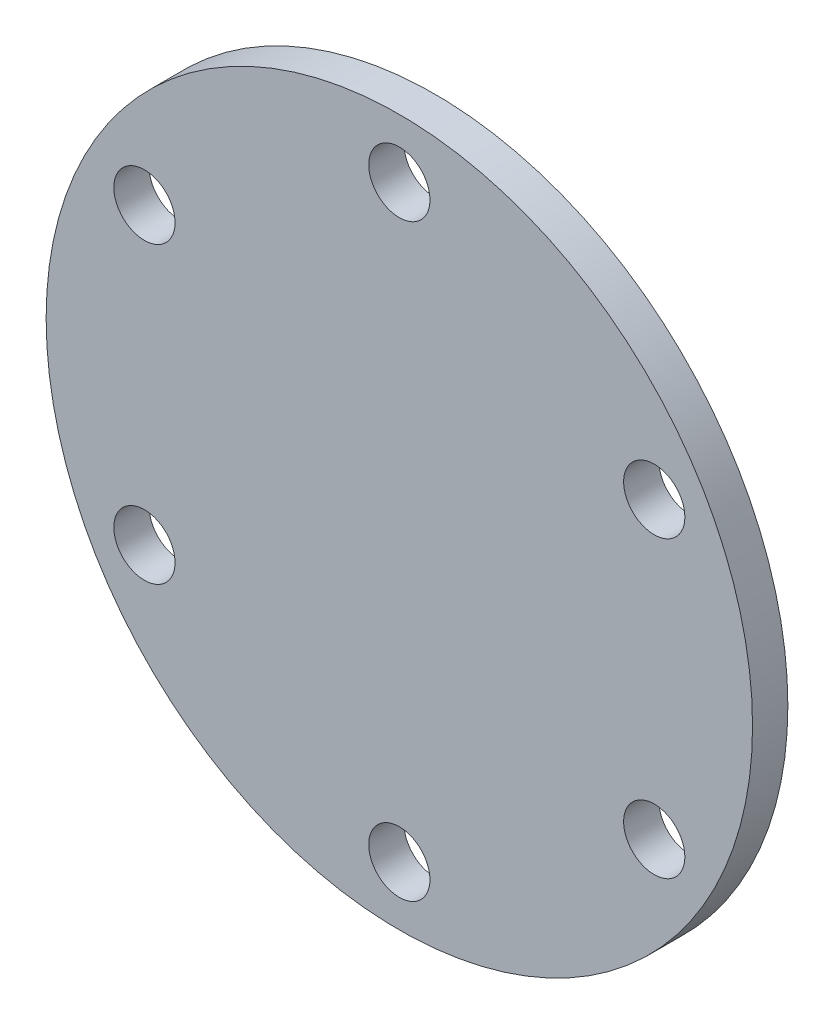
ISO-10303-21;
HEADER;
FILE_DESCRIPTION(('STEP AP214'),'2;1');
FILE_NAME('part.step','',(''),(''),'','','');
FILE_SCHEMA(('AUTOMOTIVE_DESIGN { 1 0 10303 214 1 1 1 1 }'));
ENDSEC;
DATA;
#1=APPLICATION_CONTEXT('core data for automotive mechanical design processes');
#2=APPLICATION_PROTOCOL_DEFINITION('international standard','automotive_design',2000,#1);
#3=PRODUCT_CONTEXT('',#1,'mechanical');
#4=PRODUCT('Part','Part','',(#3));
#5=PRODUCT_RELATED_PRODUCT_CATEGORY('part','',(#4));
#6=PRODUCT_DEFINITION_FORMATION('','',#4);
#7=PRODUCT_DEFINITION_CONTEXT('part definition',#1,'design');
#8=PRODUCT_DEFINITION('design','',#6,#7);
#9=PRODUCT_DEFINITION_SHAPE('','',#8);
#10=(LENGTH_UNIT() NAMED_UNIT(*) SI_UNIT(.MILLI.,.METRE.));
#11=(NAMED_UNIT(*) PLANE_ANGLE_UNIT() SI_UNIT($,.RADIAN.));
#12=(NAMED_UNIT(*) SI_UNIT($,.STERADIAN.) SOLID_ANGLE_UNIT());
#13=UNCERTAINTY_MEASURE_WITH_UNIT(LENGTH_MEASURE(1.E-05),#10,'distance_accuracy_value','');
#14=(GEOMETRIC_REPRESENTATION_CONTEXT(3) GLOBAL_UNCERTAINTY_ASSIGNED_CONTEXT((#13)) GLOBAL_UNIT_ASSIGNED_CONTEXT((#10,
#11,#12)) REPRESENTATION_CONTEXT('',''));
#15=CARTESIAN_POINT('',(0.,0.,0.));
#16=DIRECTION('',(0.,0.,1.));
#17=DIRECTION('',(1.,0.,0.));
#18=AXIS2_PLACEMENT_3D('',#15,#16,#17);
#19=CARTESIAN_POINT('',(0.,0.,3.));
#20=DIRECTION('',(0.,0.,1.));
#21=DIRECTION('',(1.,0.,0.));
#22=AXIS2_PLACEMENT_3D('',#19,#20,#21);
#23=PLANE('',#22);
#24=CARTESIAN_POINT('',(-21.650635094611,-12.5,3.));
#25=DIRECTION('',(0.,0.,1.));
#26=DIRECTION('',(1.,0.,0.));
#27=AXIS2_PLACEMENT_3D('',#24,#25,#26);
#28=CIRCLE('',#27,2.60000000000024);
#29=CARTESIAN_POINT('',(-19.0506350946107,-12.5,3.));
#30=VERTEX_POINT('',#29);
#31=EDGE_CURVE('E70',#30,#30,#28,.T.);
#32=ORIENTED_EDGE('',*,*,#31,.F.);
#33=EDGE_LOOP('',(#32));
#34=FACE_BOUND('',#33,.T.);
#35=CARTESIAN_POINT('',(21.650635094611,-12.5,3.));
#36=DIRECTION('',(0.,0.,1.));
#37=DIRECTION('',(1.,0.,0.));
#38=AXIS2_PLACEMENT_3D('',#35,#36,#37);
#39=CIRCLE('',#38,2.60000000000012);
#40=CARTESIAN_POINT('',(24.2506350946111,-12.5,3.));
#41=VERTEX_POINT('',#40);
#42=EDGE_CURVE('E58',#41,#41,#39,.T.);
#43=ORIENTED_EDGE('',*,*,#42,.F.);
#44=EDGE_LOOP('',(#43));
#45=FACE_BOUND('',#44,.T.);
#46=CARTESIAN_POINT('',(0.,25.,3.));
#47=DIRECTION('',(0.,0.,1.));
#48=DIRECTION('',(1.,0.,0.));
#49=AXIS2_PLACEMENT_3D('',#46,#47,#48);
#50=CIRCLE('',#49,2.6);
#51=CARTESIAN_POINT('',(2.6,25.,3.));
#52=VERTEX_POINT('',#51);
#53=EDGE_CURVE('E47',#52,#52,#50,.T.);
#54=ORIENTED_EDGE('',*,*,#53,.F.);
#55=EDGE_LOOP('',(#54));
#56=FACE_BOUND('',#55,.T.);
#57=CARTESIAN_POINT('',(0.,0.,3.));
#58=DIRECTION('',(0.,0.,1.));
#59=DIRECTION('',(1.,0.,0.));
#60=AXIS2_PLACEMENT_3D('',#57,#58,#59);
#61=CIRCLE('',#60,30.);
#62=CARTESIAN_POINT('',(30.,0.,3.));
#63=VERTEX_POINT('',#62);
#64=EDGE_CURVE('E10',#63,#63,#61,.T.);
#65=ORIENTED_EDGE('',*,*,#64,.T.);
#66=EDGE_LOOP('',(#65));
#67=FACE_BOUND('',#66,.T.);
#68=CARTESIAN_POINT('',(21.650635094611,12.5,3.));
#69=DIRECTION('',(0.,0.,1.));
#70=DIRECTION('',(1.,0.,0.));
#71=AXIS2_PLACEMENT_3D('',#68,#69,#70);
#72=CIRCLE('',#71,2.60000000000006);
#73=CARTESIAN_POINT('',(24.250635094611,12.5,3.));
#74=VERTEX_POINT('',#73);
#75=EDGE_CURVE('E52',#74,#74,#72,.T.);
#76=ORIENTED_EDGE('',*,*,#75,.F.);
#77=EDGE_LOOP('',(#76));
#78=FACE_BOUND('',#77,.T.);
#79=CARTESIAN_POINT('',(0.,-25.,3.));
#80=DIRECTION('',(0.,0.,1.));
#81=DIRECTION('',(1.,0.,0.));
#82=AXIS2_PLACEMENT_3D('',#79,#80,#81);
#83=CIRCLE('',#82,2.60000000000017);
#84=CARTESIAN_POINT('',(2.60000000000017,-25.,3.));
#85=VERTEX_POINT('',#84);
#86=EDGE_CURVE('E64',#85,#85,#83,.T.);
#87=ORIENTED_EDGE('',*,*,#86,.F.);
#88=EDGE_LOOP('',(#87));
#89=FACE_BOUND('',#88,.T.);
#90=CARTESIAN_POINT('',(-21.650635094611,12.5,3.));
#91=DIRECTION('',(0.,0.,1.));
#92=DIRECTION('',(1.,0.,0.));
#93=AXIS2_PLACEMENT_3D('',#90,#91,#92);
#94=CIRCLE('',#93,2.60000000000029);
#95=CARTESIAN_POINT('',(-19.0506350946107,12.5,3.));
#96=VERTEX_POINT('',#95);
#97=EDGE_CURVE('E76',#96,#96,#94,.T.);
#98=ORIENTED_EDGE('',*,*,#97,.F.);
#99=EDGE_LOOP('',(#98));
#100=FACE_BOUND('',#99,.T.);
#101=ADVANCED_FACE('F36',(#34,#45,#56,#67,#78,#89,#100),#23,.T.);
#102=CARTESIAN_POINT('',(0.,0.,0.));
#103=DIRECTION('',(0.,0.,1.));
#104=DIRECTION('',(1.,0.,0.));
#105=AXIS2_PLACEMENT_3D('',#102,#103,#104);
#106=PLANE('',#105);
#107=CARTESIAN_POINT('',(0.,0.,0.));
#108=DIRECTION('',(0.,0.,1.));
#109=DIRECTION('',(1.,0.,0.));
#110=AXIS2_PLACEMENT_3D('',#107,#108,#109);
#111=CIRCLE('',#110,30.);
#112=CARTESIAN_POINT('',(30.,0.,0.));
#113=VERTEX_POINT('',#112);
#114=EDGE_CURVE('E40',#113,#113,#111,.T.);
#115=ORIENTED_EDGE('',*,*,#114,.F.);
#116=EDGE_LOOP('',(#115));
#117=FACE_BOUND('',#116,.T.);
#118=CARTESIAN_POINT('',(0.,25.,0.));
#119=DIRECTION('',(0.,0.,1.));
#120=DIRECTION('',(1.,0.,0.));
#121=AXIS2_PLACEMENT_3D('',#118,#119,#120);
#122=CIRCLE('',#121,2.6);
#123=CARTESIAN_POINT('',(2.6,25.,0.));
#124=VERTEX_POINT('',#123);
#125=EDGE_CURVE('E49',#124,#124,#122,.T.);
#126=ORIENTED_EDGE('',*,*,#125,.T.);
#127=EDGE_LOOP('',(#126));
#128=FACE_BOUND('',#127,.T.);
#129=CARTESIAN_POINT('',(21.650635094611,12.5,0.));
#130=DIRECTION('',(0.,0.,1.));
#131=DIRECTION('',(1.,0.,0.));
#132=AXIS2_PLACEMENT_3D('',#129,#130,#131);
#133=CIRCLE('',#132,2.60000000000006);
#134=CARTESIAN_POINT('',(24.250635094611,12.5,0.));
#135=VERTEX_POINT('',#134);
#136=EDGE_CURVE('E55',#135,#135,#133,.T.);
#137=ORIENTED_EDGE('',*,*,#136,.T.);
#138=EDGE_LOOP('',(#137));
#139=FACE_BOUND('',#138,.T.);
#140=CARTESIAN_POINT('',(21.650635094611,-12.5,0.));
#141=DIRECTION('',(0.,0.,1.));
#142=DIRECTION('',(1.,0.,0.));
#143=AXIS2_PLACEMENT_3D('',#140,#141,#142);
#144=CIRCLE('',#143,2.60000000000012);
#145=CARTESIAN_POINT('',(24.2506350946111,-12.5,0.));
#146=VERTEX_POINT('',#145);
#147=EDGE_CURVE('E61',#146,#146,#144,.T.);
#148=ORIENTED_EDGE('',*,*,#147,.T.);
#149=EDGE_LOOP('',(#148));
#150=FACE_BOUND('',#149,.T.);
#151=CARTESIAN_POINT('',(0.,-25.,0.));
#152=DIRECTION('',(0.,0.,1.));
#153=DIRECTION('',(1.,0.,0.));
#154=AXIS2_PLACEMENT_3D('',#151,#152,#153);
#155=CIRCLE('',#154,2.60000000000017);
#156=CARTESIAN_POINT('',(2.60000000000017,-25.,0.));
#157=VERTEX_POINT('',#156);
#158=EDGE_CURVE('E67',#157,#157,#155,.T.);
#159=ORIENTED_EDGE('',*,*,#158,.T.);
#160=EDGE_LOOP('',(#159));
#161=FACE_BOUND('',#160,.T.);
#162=CARTESIAN_POINT('',(-21.650635094611,-12.5,0.));
#163=DIRECTION('',(0.,0.,1.));
#164=DIRECTION('',(1.,0.,0.));
#165=AXIS2_PLACEMENT_3D('',#162,#163,#164);
#166=CIRCLE('',#165,2.60000000000024);
#167=CARTESIAN_POINT('',(-19.0506350946107,-12.5,0.));
#168=VERTEX_POINT('',#167);
#169=EDGE_CURVE('E73',#168,#168,#166,.T.);
#170=ORIENTED_EDGE('',*,*,#169,.T.);
#171=EDGE_LOOP('',(#170));
#172=FACE_BOUND('',#171,.T.);
#173=CARTESIAN_POINT('',(-21.650635094611,12.5,0.));
#174=DIRECTION('',(0.,0.,1.));
#175=DIRECTION('',(1.,0.,0.));
#176=AXIS2_PLACEMENT_3D('',#173,#174,#175);
#177=CIRCLE('',#176,2.60000000000029);
#178=CARTESIAN_POINT('',(-19.0506350946107,12.5,0.));
#179=VERTEX_POINT('',#178);
#180=EDGE_CURVE('E79',#179,#179,#177,.T.);
#181=ORIENTED_EDGE('',*,*,#180,.T.);
#182=EDGE_LOOP('',(#181));
#183=FACE_BOUND('',#182,.T.);
#184=ADVANCED_FACE('F89',(#117,#128,#139,#150,#161,#172,#183),#106,.F.);
#185=CARTESIAN_POINT('',(0.,0.,3.));
#186=DIRECTION('',(0.,0.,-1.));
#187=DIRECTION('',(-1.,0.,0.));
#188=AXIS2_PLACEMENT_3D('',#185,#186,#187);
#189=CYLINDRICAL_SURFACE('',#188,30.);
#190=ORIENTED_EDGE('',*,*,#64,.F.);
#191=EDGE_LOOP('',(#190));
#192=FACE_BOUND('',#191,.T.);
#193=ORIENTED_EDGE('',*,*,#114,.T.);
#194=EDGE_LOOP('',(#193));
#195=FACE_BOUND('',#194,.T.);
#196=ADVANCED_FACE('F38',(#192,#195),#189,.T.);
#197=CARTESIAN_POINT('',(0.,25.,3.));
#198=DIRECTION('',(0.,0.,-1.));
#199=DIRECTION('',(-1.,0.,0.));
#200=AXIS2_PLACEMENT_3D('',#197,#198,#199);
#201=CYLINDRICAL_SURFACE('',#200,2.6);
#202=ORIENTED_EDGE('',*,*,#53,.T.);
#203=EDGE_LOOP('',(#202));
#204=FACE_BOUND('',#203,.T.);
#205=ORIENTED_EDGE('',*,*,#125,.F.);
#206=EDGE_LOOP('',(#205));
#207=FACE_BOUND('',#206,.T.);
#208=ADVANCED_FACE('F99',(#204,#207),#201,.F.);
#209=CARTESIAN_POINT('',(21.650635094611,12.5,3.));
#210=DIRECTION('',(0.,0.,-1.));
#211=DIRECTION('',(-1.,0.,0.));
#212=AXIS2_PLACEMENT_3D('',#209,#210,#211);
#213=CYLINDRICAL_SURFACE('',#212,2.60000000000006);
#214=ORIENTED_EDGE('',*,*,#75,.T.);
#215=EDGE_LOOP('',(#214));
#216=FACE_BOUND('',#215,.T.);
#217=ORIENTED_EDGE('',*,*,#136,.F.);
#218=EDGE_LOOP('',(#217));
#219=FACE_BOUND('',#218,.T.);
#220=ADVANCED_FACE('F102',(#216,#219),#213,.F.);
#221=CARTESIAN_POINT('',(21.650635094611,-12.5,3.));
#222=DIRECTION('',(0.,0.,-1.));
#223=DIRECTION('',(-1.,0.,0.));
#224=AXIS2_PLACEMENT_3D('',#221,#222,#223);
#225=CYLINDRICAL_SURFACE('',#224,2.60000000000012);
#226=ORIENTED_EDGE('',*,*,#42,.T.);
#227=EDGE_LOOP('',(#226));
#228=FACE_BOUND('',#227,.T.);
#229=ORIENTED_EDGE('',*,*,#147,.F.);
#230=EDGE_LOOP('',(#229));
#231=FACE_BOUND('',#230,.T.);
#232=ADVANCED_FACE('F106',(#228,#231),#225,.F.);
#233=CARTESIAN_POINT('',(0.,-25.,3.));
#234=DIRECTION('',(0.,0.,-1.));
#235=DIRECTION('',(-1.,0.,0.));
#236=AXIS2_PLACEMENT_3D('',#233,#234,#235);
#237=CYLINDRICAL_SURFACE('',#236,2.60000000000017);
#238=ORIENTED_EDGE('',*,*,#86,.T.);
#239=EDGE_LOOP('',(#238));
#240=FACE_BOUND('',#239,.T.);
#241=ORIENTED_EDGE('',*,*,#158,.F.);
#242=EDGE_LOOP('',(#241));
#243=FACE_BOUND('',#242,.T.);
#244=ADVANCED_FACE('F110',(#240,#243),#237,.F.);
#245=CARTESIAN_POINT('',(-21.650635094611,-12.5,3.));
#246=DIRECTION('',(0.,0.,-1.));
#247=DIRECTION('',(-1.,0.,0.));
#248=AXIS2_PLACEMENT_3D('',#245,#246,#247);
#249=CYLINDRICAL_SURFACE('',#248,2.60000000000024);
#250=ORIENTED_EDGE('',*,*,#31,.T.);
#251=EDGE_LOOP('',(#250));
#252=FACE_BOUND('',#251,.T.);
#253=ORIENTED_EDGE('',*,*,#169,.F.);
#254=EDGE_LOOP('',(#253));
#255=FACE_BOUND('',#254,.T.);
#256=ADVANCED_FACE('F114',(#252,#255),#249,.F.);
#257=CARTESIAN_POINT('',(-21.650635094611,12.5,3.));
#258=DIRECTION('',(0.,0.,-1.));
#259=DIRECTION('',(-1.,0.,0.));
#260=AXIS2_PLACEMENT_3D('',#257,#258,#259);
#261=CYLINDRICAL_SURFACE('',#260,2.60000000000029);
#262=ORIENTED_EDGE('',*,*,#97,.T.);
#263=EDGE_LOOP('',(#262));
#264=FACE_BOUND('',#263,.T.);
#265=ORIENTED_EDGE('',*,*,#180,.F.);
#266=EDGE_LOOP('',(#265));
#267=FACE_BOUND('',#266,.T.);
#268=ADVANCED_FACE('F85',(#264,#267),#261,.F.);
#269=CLOSED_SHELL('',(#101,#184,#196,#208,#220,#232,#244,#256,#268));
#270=MANIFOLD_SOLID_BREP('B2',#269);
#271=ADVANCED_BREP_SHAPE_REPRESENTATION('',(#18,#270),#14);
#272=SHAPE_DEFINITION_REPRESENTATION(#9,#271);
ENDSEC;
END-ISO-10303-21;
